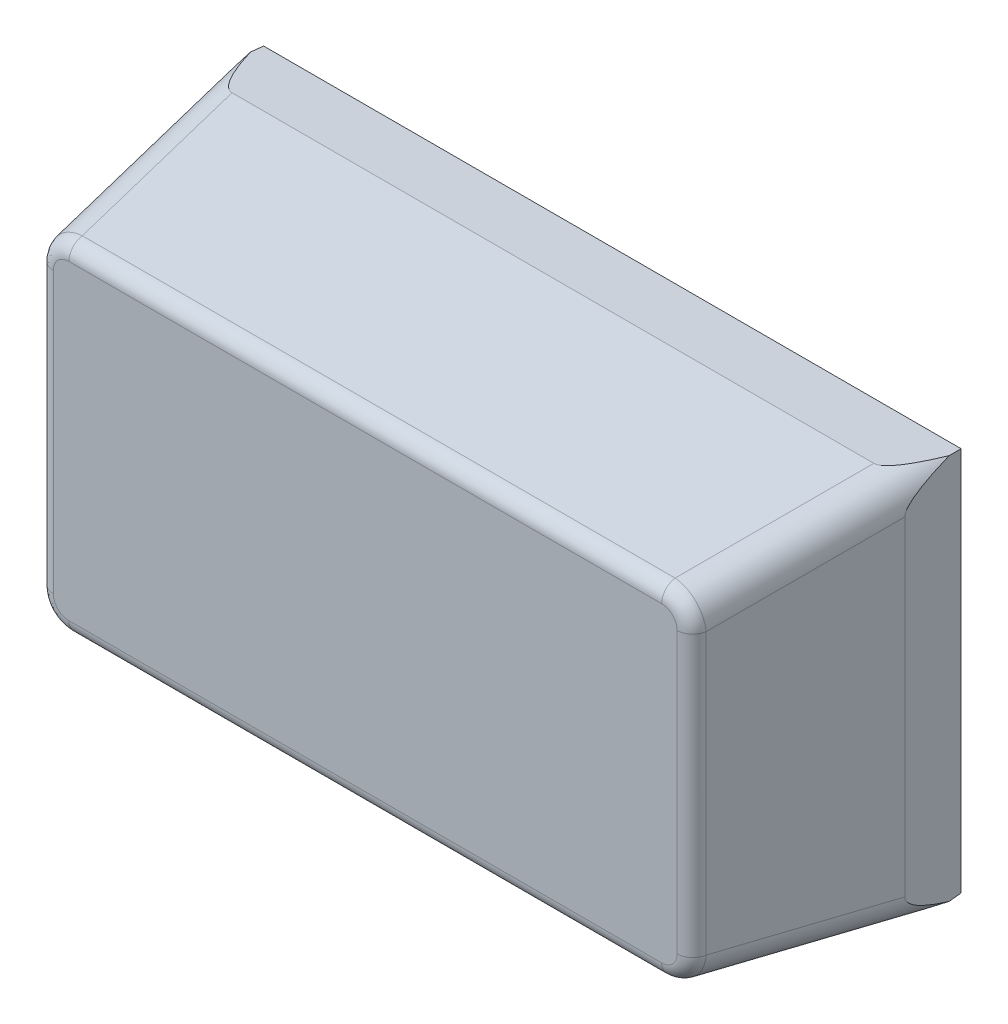
ISO-10303-21;
HEADER;
FILE_DESCRIPTION(('STEP AP214'),'2;1');
FILE_NAME('part.step','',(''),(''),'','','');
FILE_SCHEMA(('AUTOMOTIVE_DESIGN { 1 0 10303 214 1 1 1 1 }'));
ENDSEC;
DATA;
#1=APPLICATION_CONTEXT('core data for automotive mechanical design processes');
#2=APPLICATION_PROTOCOL_DEFINITION('international standard','automotive_design',2000,#1);
#3=PRODUCT_CONTEXT('',#1,'mechanical');
#4=PRODUCT('Part','Part','',(#3));
#5=PRODUCT_RELATED_PRODUCT_CATEGORY('part','',(#4));
#6=PRODUCT_DEFINITION_FORMATION('','',#4);
#7=PRODUCT_DEFINITION_CONTEXT('part definition',#1,'design');
#8=PRODUCT_DEFINITION('design','',#6,#7);
#9=PRODUCT_DEFINITION_SHAPE('','',#8);
#10=(LENGTH_UNIT() NAMED_UNIT(*) SI_UNIT(.MILLI.,.METRE.));
#11=(NAMED_UNIT(*) PLANE_ANGLE_UNIT() SI_UNIT($,.RADIAN.));
#12=(NAMED_UNIT(*) SI_UNIT($,.STERADIAN.) SOLID_ANGLE_UNIT());
#13=UNCERTAINTY_MEASURE_WITH_UNIT(LENGTH_MEASURE(1.E-05),#10,'distance_accuracy_value','');
#14=(GEOMETRIC_REPRESENTATION_CONTEXT(3) GLOBAL_UNCERTAINTY_ASSIGNED_CONTEXT((#13)) GLOBAL_UNIT_ASSIGNED_CONTEXT((#10,
#11,#12)) REPRESENTATION_CONTEXT('',''));
#15=CARTESIAN_POINT('',(0.,0.,0.));
#16=DIRECTION('',(0.,0.,1.));
#17=DIRECTION('',(1.,0.,0.));
#18=AXIS2_PLACEMENT_3D('',#15,#16,#17);
#19=CARTESIAN_POINT('',(27.87499984,24.459995486836,1.6));
#20=DIRECTION('',(0.,0.,1.));
#21=DIRECTION('',(1.,0.,0.));
#22=AXIS2_PLACEMENT_3D('',#19,#20,#21);
#23=PLANE('',#22);
#24=CARTESIAN_POINT('',(29.770395357701,25.454417811411,1.6));
#25=CARTESIAN_POINT('',(29.792772197807,25.454417811411,1.6));
#26=CARTESIAN_POINT('',(29.844777688286,25.436497601739,1.6));
#27=CARTESIAN_POINT('',(29.869422164575,25.385226791345,1.6));
#28=CARTESIAN_POINT('',(29.869422164575,25.355391004537,1.6));
#29=B_SPLINE_CURVE_WITH_KNOTS('',3,(#24,#25,#26,#27,#28),.UNSPECIFIED.,.F.,.F.,(4,1,4),
(-0.775712981729,-0.110816140247,0.775712981729),.UNSPECIFIED.);
#30=CARTESIAN_POINT('',(29.869422164575,25.355391004537,1.6));
#31=VERTEX_POINT('',#30);
#32=CARTESIAN_POINT('',(29.770395357701,25.454417811411,1.6));
#33=VERTEX_POINT('',#32);
#34=EDGE_CURVE('E436',#31,#33,#29,.F.);
#35=ORIENTED_EDGE('',*,*,#34,.T.);
#36=DIRECTION('',(1.,0.,0.));
#37=VECTOR('',#36,1.);
#38=CARTESIAN_POINT('',(28.43749984,25.454417811411,1.6));
#39=LINE('',#38,#37);
#40=CARTESIAN_POINT('',(25.979604322299,25.454417811411,1.6));
#41=VERTEX_POINT('',#40);
#42=EDGE_CURVE('E374',#41,#33,#39,.T.);
#43=ORIENTED_EDGE('',*,*,#42,.F.);
#44=CARTESIAN_POINT('',(25.880577515424,25.355391004537,1.6));
#45=CARTESIAN_POINT('',(25.880577515424,25.377767844643,1.6));
#46=CARTESIAN_POINT('',(25.898497725097,25.429773335122,1.6));
#47=CARTESIAN_POINT('',(25.949768535491,25.454417811411,1.6));
#48=CARTESIAN_POINT('',(25.979604322299,25.454417811411,1.6));
#49=B_SPLINE_CURVE_WITH_KNOTS('',3,(#44,#45,#46,#47,#48),.UNSPECIFIED.,.F.,.F.,(4,1,4),
(-0.775712981729,-0.110816140247,0.775712981729),.UNSPECIFIED.);
#50=CARTESIAN_POINT('',(25.880577515424,25.355391004537,1.6));
#51=VERTEX_POINT('',#50);
#52=EDGE_CURVE('E553',#41,#51,#49,.F.);
#53=ORIENTED_EDGE('',*,*,#52,.T.);
#54=DIRECTION('',(0.,1.,0.));
#55=VECTOR('',#54,1.);
#56=CARTESIAN_POINT('',(25.880577515424,24.772495486836,1.6));
#57=LINE('',#56,#55);
#58=CARTESIAN_POINT('',(25.880577515424,23.564599969135,1.6));
#59=VERTEX_POINT('',#58);
#60=EDGE_CURVE('E286',#59,#51,#57,.T.);
#61=ORIENTED_EDGE('',*,*,#60,.F.);
#62=CARTESIAN_POINT('',(25.979604322299,23.46557316226,1.6));
#63=CARTESIAN_POINT('',(25.957227482193,23.46557316226,1.6));
#64=CARTESIAN_POINT('',(25.905221991713,23.483493371933,1.6));
#65=CARTESIAN_POINT('',(25.880577515424,23.534764182327,1.6));
#66=CARTESIAN_POINT('',(25.880577515424,23.564599969135,1.6));
#67=B_SPLINE_CURVE_WITH_KNOTS('',3,(#62,#63,#64,#65,#66),.UNSPECIFIED.,.F.,.F.,(4,1,4),
(-0.775712981729,-0.110816140247,0.775712981729),.UNSPECIFIED.);
#68=CARTESIAN_POINT('',(25.979604322299,23.46557316226,1.6));
#69=VERTEX_POINT('',#68);
#70=EDGE_CURVE('E537',#59,#69,#67,.F.);
#71=ORIENTED_EDGE('',*,*,#70,.T.);
#72=DIRECTION('',(-1.,0.,0.));
#73=VECTOR('',#72,1.);
#74=CARTESIAN_POINT('',(27.31249984,23.46557316226,1.6));
#75=LINE('',#74,#73);
#76=CARTESIAN_POINT('',(29.770395357701,23.46557316226,1.6));
#77=VERTEX_POINT('',#76);
#78=EDGE_CURVE('E526',#77,#69,#75,.T.);
#79=ORIENTED_EDGE('',*,*,#78,.F.);
#80=CARTESIAN_POINT('',(29.869422164575,23.564599969135,1.6));
#81=CARTESIAN_POINT('',(29.869422164575,23.542223129029,1.6));
#82=CARTESIAN_POINT('',(29.851501954903,23.490217638549,1.6));
#83=CARTESIAN_POINT('',(29.800231144509,23.46557316226,1.6));
#84=CARTESIAN_POINT('',(29.770395357701,23.46557316226,1.6));
#85=B_SPLINE_CURVE_WITH_KNOTS('',3,(#80,#81,#82,#83,#84),.UNSPECIFIED.,.F.,.F.,(4,1,4),
(-0.775712981729,-0.110816140247,0.775712981729),.UNSPECIFIED.);
#86=CARTESIAN_POINT('',(29.869422164575,23.564599969135,1.6));
#87=VERTEX_POINT('',#86);
#88=EDGE_CURVE('E533',#77,#87,#85,.F.);
#89=ORIENTED_EDGE('',*,*,#88,.T.);
#90=DIRECTION('',(0.,-1.,0.));
#91=VECTOR('',#90,1.);
#92=CARTESIAN_POINT('',(29.869422164575,24.147495486836,1.6));
#93=LINE('',#92,#91);
#94=EDGE_CURVE('E429',#31,#87,#93,.T.);
#95=ORIENTED_EDGE('',*,*,#94,.F.);
#96=EDGE_LOOP('',(#35,#43,#53,#61,#71,#79,#89,#95));
#97=FACE_BOUND('',#96,.T.);
#98=ADVANCED_FACE('F17',(#97),#23,.T.);
#99=CARTESIAN_POINT('',(27.31249984,23.46557316226,1.5));
#100=DIRECTION('',(-1.,0.,0.));
#101=DIRECTION('',(0.,-1.,0.));
#102=AXIS2_PLACEMENT_3D('',#99,#100,#101);
#103=CYLINDRICAL_SURFACE('',#102,0.1);
#104=CARTESIAN_POINT('',(29.770395357701,23.46557316226,1.6));
#105=CARTESIAN_POINT('',(29.770395357701,23.438312781563,1.6));
#106=CARTESIAN_POINT('',(29.770395357701,23.390923922426,1.579403749562));
#107=CARTESIAN_POINT('',(29.770395357701,23.369391789173,1.534163623506));
#108=CARTESIAN_POINT('',(29.770395357701,23.366546355386,1.513917310096));
#109=B_SPLINE_CURVE_WITH_KNOTS('',3,(#104,#105,#106,#107,#108),.UNSPECIFIED.,.F.,.F.,(4,1,4),
(0.,0.571428571429,1.),.UNSPECIFIED.);
#110=CARTESIAN_POINT('',(29.770395357701,23.3665463553862,1.51391731009597));
#111=VERTEX_POINT('',#110);
#112=EDGE_CURVE('E507',#111,#77,#109,.F.);
#113=ORIENTED_EDGE('',*,*,#112,.T.);
#114=ORIENTED_EDGE('',*,*,#78,.T.);
#115=CARTESIAN_POINT('',(25.979604322299,23.366546355386,1.513917310096));
#116=CARTESIAN_POINT('',(25.979604322299,23.369391789173,1.534163623506));
#117=CARTESIAN_POINT('',(25.979604322299,23.390923922426,1.579403749562));
#118=CARTESIAN_POINT('',(25.979604322299,23.438312781563,1.6));
#119=CARTESIAN_POINT('',(25.979604322299,23.46557316226,1.6));
#120=B_SPLINE_CURVE_WITH_KNOTS('',3,(#115,#116,#117,#118,#119),.UNSPECIFIED.,.F.,.F.,(4,1,4),
(0.,0.428571428571,1.),.UNSPECIFIED.);
#121=CARTESIAN_POINT('',(25.979604322299,23.3665463553863,1.51391731009597));
#122=VERTEX_POINT('',#121);
#123=EDGE_CURVE('E548',#69,#122,#120,.F.);
#124=ORIENTED_EDGE('',*,*,#123,.T.);
#125=DIRECTION('',(1.,0.,0.));
#126=VECTOR('',#125,1.);
#127=CARTESIAN_POINT('',(26.74999984,23.3665463553858,1.51391731009602));
#128=LINE('',#127,#126);
#129=EDGE_CURVE('E284',#111,#122,#128,.F.);
#130=ORIENTED_EDGE('',*,*,#129,.F.);
#131=EDGE_LOOP('',(#113,#114,#124,#130));
#132=FACE_BOUND('',#131,.T.);
#133=ADVANCED_FACE('F479',(#132),#103,.T.);
#134=CARTESIAN_POINT('',(29.869422164575,23.564599969135,1.6));
#135=CARTESIAN_POINT('',(29.869422164575,23.542223129029,1.6));
#136=CARTESIAN_POINT('',(29.851501954903,23.490217638549,1.6));
#137=CARTESIAN_POINT('',(29.800231144509,23.46557316226,1.6));
#138=CARTESIAN_POINT('',(29.770395357701,23.46557316226,1.6));
#139=CARTESIAN_POINT('',(29.896682545273,23.564599969135,1.6));
#140=CARTESIAN_POINT('',(29.896091933837,23.536162177792,1.599981514956));
#141=CARTESIAN_POINT('',(29.872553004294,23.470846015028,1.600018425103));
#142=CARTESIAN_POINT('',(29.808312412825,23.439100263477,1.599975353274));
#143=CARTESIAN_POINT('',(29.770395357701,23.438312781563,1.6));
#144=CARTESIAN_POINT('',(29.94407140441,23.564599969135,1.579403749562));
#145=CARTESIAN_POINT('',(29.942512173285,23.525690770421,1.580335356779));
#146=CARTESIAN_POINT('',(29.909229722522,23.437117142633,1.581663248521));
#147=CARTESIAN_POINT('',(29.82227428932,23.393002897259,1.580645892518));
#148=CARTESIAN_POINT('',(29.770395357701,23.390923922426,1.579403749562));
#149=CARTESIAN_POINT('',(29.965603537663,23.564599969135,1.534163623506));
#150=CARTESIAN_POINT('',(29.964615523762,23.520890039066,1.536673629749));
#151=CARTESIAN_POINT('',(29.928025975,23.42001624079,1.540424754506));
#152=CARTESIAN_POINT('',(29.828675264459,23.370709141041,1.537510298497));
#153=CARTESIAN_POINT('',(29.770395357701,23.369391789173,1.534163623506));
#154=CARTESIAN_POINT('',(29.96844897145,23.564599969135,1.513917310096));
#155=CARTESIAN_POINT('',(29.968023786504,23.520271473869,1.516942658188));
#156=CARTESIAN_POINT('',(29.931535708767,23.416908151302,1.521550987102));
#157=CARTESIAN_POINT('',(29.829500018056,23.367113268648,1.517951107552));
#158=CARTESIAN_POINT('',(29.770395357701,23.366546355386,1.513917310096));
#159=B_SPLINE_SURFACE_WITH_KNOTS('',3,3,((#134,#135,#136,#137,#138),(#139,#140,#141,#142,#143),
(#144,#145,#146,#147,#148),(#149,#150,#151,#152,#153),(#154,#155,#156,#157,#158)),.UNSPECIFIED.,
.F.,.F.,.F.,(4,1,4),(4,1,4),(0.,0.571428571429,1.),(-0.775712981729,-0.110816140247,
0.775712981729),.UNSPECIFIED.);
#160=CARTESIAN_POINT('',(29.770395357701,23.366546355386,1.513917310096));
#161=CARTESIAN_POINT('',(29.829500018056,23.367113268648,1.517951107552));
#162=CARTESIAN_POINT('',(29.931535708767,23.416908151302,1.521550987102));
#163=CARTESIAN_POINT('',(29.968023786504,23.520271473869,1.516942658188));
#164=CARTESIAN_POINT('',(29.96844897145,23.564599969135,1.513917310096));
#165=B_SPLINE_CURVE_WITH_KNOTS('',3,(#160,#161,#162,#163,#164),.UNSPECIFIED.,.F.,.F.,(4,1,4),
(-0.775712981729,0.110816140247,0.775712981729),.UNSPECIFIED.);
#166=CARTESIAN_POINT('',(29.9684489714498,23.564599969135,1.51391731009597));
#167=VERTEX_POINT('',#166);
#168=EDGE_CURVE('E277',#167,#111,#165,.F.);
#169=CARTESIAN_POINT('',(29.96844897145,23.564599969135,1.513917310096));
#170=CARTESIAN_POINT('',(29.965603537663,23.564599969135,1.534163623506));
#171=CARTESIAN_POINT('',(29.94407140441,23.564599969135,1.579403749562));
#172=CARTESIAN_POINT('',(29.896682545273,23.564599969135,1.6));
#173=CARTESIAN_POINT('',(29.869422164575,23.564599969135,1.6));
#174=B_SPLINE_CURVE_WITH_KNOTS('',3,(#169,#170,#171,#172,#173),.UNSPECIFIED.,.F.,.F.,(4,1,4),
(0.,0.428571428571,1.),.UNSPECIFIED.);
#175=EDGE_CURVE('E437',#87,#167,#174,.F.);
#176=ORIENTED_EDGE('',*,*,#168,.F.);
#177=ORIENTED_EDGE('',*,*,#175,.F.);
#178=ORIENTED_EDGE('',*,*,#88,.F.);
#179=ORIENTED_EDGE('',*,*,#112,.F.);
#180=EDGE_LOOP('',(#176,#177,#178,#179));
#181=FACE_BOUND('',#180,.T.);
#182=ADVANCED_FACE('F468',(#181),#159,.F.);
#183=CARTESIAN_POINT('',(29.869422164575,24.147495486836,1.5));
#184=DIRECTION('',(0.,-1.,0.));
#185=DIRECTION('',(1.,0.,0.));
#186=AXIS2_PLACEMENT_3D('',#183,#184,#185);
#187=CYLINDRICAL_SURFACE('',#186,0.1);
#188=CARTESIAN_POINT('',(29.869422164575,25.355391004537,1.6));
#189=CARTESIAN_POINT('',(29.896682545273,25.355391004537,1.6));
#190=CARTESIAN_POINT('',(29.94407140441,25.355391004537,1.579403749562));
#191=CARTESIAN_POINT('',(29.965603537663,25.355391004537,1.534163623506));
#192=CARTESIAN_POINT('',(29.96844897145,25.355391004537,1.513917310096));
#193=B_SPLINE_CURVE_WITH_KNOTS('',3,(#188,#189,#190,#191,#192),.UNSPECIFIED.,.F.,.F.,(4,1,4),
(0.,0.571428571429,1.),.UNSPECIFIED.);
#194=CARTESIAN_POINT('',(29.9684489714496,25.3553910045369,1.51391731009593));
#195=VERTEX_POINT('',#194);
#196=EDGE_CURVE('E414',#195,#31,#193,.F.);
#197=ORIENTED_EDGE('',*,*,#196,.T.);
#198=ORIENTED_EDGE('',*,*,#94,.T.);
#199=ORIENTED_EDGE('',*,*,#175,.T.);
#200=DIRECTION('',(0.,1.,0.));
#201=VECTOR('',#200,1.);
#202=CARTESIAN_POINT('',(29.9684489714502,23.834995486836,1.51391731009602));
#203=LINE('',#202,#201);
#204=EDGE_CURVE('E276',#195,#167,#203,.F.);
#205=ORIENTED_EDGE('',*,*,#204,.F.);
#206=EDGE_LOOP('',(#197,#198,#199,#205));
#207=FACE_BOUND('',#206,.T.);
#208=ADVANCED_FACE('F386',(#207),#187,.T.);
#209=CARTESIAN_POINT('',(29.770395357701,25.454417811411,1.6));
#210=CARTESIAN_POINT('',(29.792772197807,25.454417811411,1.6));
#211=CARTESIAN_POINT('',(29.844777688286,25.436497601739,1.6));
#212=CARTESIAN_POINT('',(29.869422164575,25.385226791345,1.6));
#213=CARTESIAN_POINT('',(29.869422164575,25.355391004537,1.6));
#214=CARTESIAN_POINT('',(29.770395357701,25.481678192109,1.6));
#215=CARTESIAN_POINT('',(29.798833149044,25.481087580673,1.599981514956));
#216=CARTESIAN_POINT('',(29.864149311808,25.45754865113,1.600018425103));
#217=CARTESIAN_POINT('',(29.895895063358,25.393308059661,1.599975353274));
#218=CARTESIAN_POINT('',(29.896682545273,25.355391004537,1.6));
#219=CARTESIAN_POINT('',(29.770395357701,25.529067051246,1.579403749562));
#220=CARTESIAN_POINT('',(29.809304556415,25.527507820121,1.580335356779));
#221=CARTESIAN_POINT('',(29.897878184203,25.494225369358,1.581663248521));
#222=CARTESIAN_POINT('',(29.941992429577,25.407269936156,1.580645892518));
#223=CARTESIAN_POINT('',(29.94407140441,25.355391004537,1.579403749562));
#224=CARTESIAN_POINT('',(29.770395357701,25.550599184499,1.534163623506));
#225=CARTESIAN_POINT('',(29.814105287769,25.549611170598,1.536673629749));
#226=CARTESIAN_POINT('',(29.914979086046,25.513021621836,1.540424754506));
#227=CARTESIAN_POINT('',(29.964286185795,25.413670911295,1.537510298497));
#228=CARTESIAN_POINT('',(29.965603537663,25.355391004537,1.534163623506));
#229=CARTESIAN_POINT('',(29.770395357701,25.553444618286,1.513917310096));
#230=CARTESIAN_POINT('',(29.814723852967,25.553019433339,1.516942658188));
#231=CARTESIAN_POINT('',(29.918087175533,25.516531355603,1.521550987102));
#232=CARTESIAN_POINT('',(29.967882058188,25.414495664891,1.517951107552));
#233=CARTESIAN_POINT('',(29.96844897145,25.355391004537,1.513917310096));
#234=B_SPLINE_SURFACE_WITH_KNOTS('',3,3,((#209,#210,#211,#212,#213),(#214,#215,#216,#217,#218),
(#219,#220,#221,#222,#223),(#224,#225,#226,#227,#228),(#229,#230,#231,#232,#233)),.UNSPECIFIED.,
.F.,.F.,.F.,(4,1,4),(4,1,4),(0.,0.571428571429,1.),(-0.775712981729,-0.110816140247,
0.775712981729),.UNSPECIFIED.);
#235=CARTESIAN_POINT('',(29.96844897145,25.355391004537,1.513917310096));
#236=CARTESIAN_POINT('',(29.967882058188,25.414495664891,1.517951107552));
#237=CARTESIAN_POINT('',(29.918087175533,25.516531355603,1.521550987102));
#238=CARTESIAN_POINT('',(29.814723852967,25.553019433339,1.516942658188));
#239=CARTESIAN_POINT('',(29.770395357701,25.553444618286,1.513917310096));
#240=B_SPLINE_CURVE_WITH_KNOTS('',3,(#235,#236,#237,#238,#239),.UNSPECIFIED.,.F.,.F.,(4,1,4),
(-0.775712981729,0.110816140247,0.775712981729),.UNSPECIFIED.);
#241=CARTESIAN_POINT('',(29.770395357701,25.5534446182854,1.51391731009592));
#242=VERTEX_POINT('',#241);
#243=EDGE_CURVE('E239',#242,#195,#240,.F.);
#244=CARTESIAN_POINT('',(29.770395357701,25.553444618286,1.513917310096));
#245=CARTESIAN_POINT('',(29.770395357701,25.550599184499,1.534163623506));
#246=CARTESIAN_POINT('',(29.770395357701,25.529067051246,1.579403749562));
#247=CARTESIAN_POINT('',(29.770395357701,25.481678192109,1.6));
#248=CARTESIAN_POINT('',(29.770395357701,25.454417811411,1.6));
#249=B_SPLINE_CURVE_WITH_KNOTS('',3,(#244,#245,#246,#247,#248),.UNSPECIFIED.,.F.,.F.,(4,1,4),
(0.,0.428571428571,1.),.UNSPECIFIED.);
#250=EDGE_CURVE('E403',#33,#242,#249,.F.);
#251=ORIENTED_EDGE('',*,*,#243,.F.);
#252=ORIENTED_EDGE('',*,*,#250,.F.);
#253=ORIENTED_EDGE('',*,*,#34,.F.);
#254=ORIENTED_EDGE('',*,*,#196,.F.);
#255=EDGE_LOOP('',(#251,#252,#253,#254));
#256=FACE_BOUND('',#255,.T.);
#257=ADVANCED_FACE('F325',(#256),#234,.F.);
#258=CARTESIAN_POINT('',(28.43749984,25.454417811411,1.5));
#259=DIRECTION('',(1.,0.,0.));
#260=DIRECTION('',(0.,1.,0.));
#261=AXIS2_PLACEMENT_3D('',#258,#259,#260);
#262=CYLINDRICAL_SURFACE('',#261,0.1);
#263=CARTESIAN_POINT('',(25.979604322299,25.454417811411,1.6));
#264=CARTESIAN_POINT('',(25.979604322299,25.481678192109,1.6));
#265=CARTESIAN_POINT('',(25.979604322299,25.529067051246,1.579403749562));
#266=CARTESIAN_POINT('',(25.979604322299,25.550599184499,1.534163623506));
#267=CARTESIAN_POINT('',(25.979604322299,25.553444618286,1.513917310096));
#268=B_SPLINE_CURVE_WITH_KNOTS('',3,(#263,#264,#265,#266,#267),.UNSPECIFIED.,.F.,.F.,(4,1,4),
(0.,0.571428571429,1.),.UNSPECIFIED.);
#269=CARTESIAN_POINT('',(25.979604322299,25.5534446182855,1.51391731009593));
#270=VERTEX_POINT('',#269);
#271=EDGE_CURVE('E357',#270,#41,#268,.F.);
#272=ORIENTED_EDGE('',*,*,#271,.T.);
#273=ORIENTED_EDGE('',*,*,#42,.T.);
#274=ORIENTED_EDGE('',*,*,#250,.T.);
#275=DIRECTION('',(1.,0.,0.));
#276=VECTOR('',#275,1.);
#277=CARTESIAN_POINT('',(28.99999984,25.5534446182852,1.51391731009589));
#278=LINE('',#277,#276);
#279=EDGE_CURVE('E227',#270,#242,#278,.T.);
#280=ORIENTED_EDGE('',*,*,#279,.F.);
#281=EDGE_LOOP('',(#272,#273,#274,#280));
#282=FACE_BOUND('',#281,.T.);
#283=ADVANCED_FACE('F324',(#282),#262,.T.);
#284=CARTESIAN_POINT('',(25.880577515424,25.355391004537,1.6));
#285=CARTESIAN_POINT('',(25.880577515424,25.377767844643,1.6));
#286=CARTESIAN_POINT('',(25.898497725097,25.429773335122,1.6));
#287=CARTESIAN_POINT('',(25.949768535491,25.454417811411,1.6));
#288=CARTESIAN_POINT('',(25.979604322299,25.454417811411,1.6));
#289=CARTESIAN_POINT('',(25.853317134727,25.355391004537,1.6));
#290=CARTESIAN_POINT('',(25.853907746163,25.38382879588,1.599981514956));
#291=CARTESIAN_POINT('',(25.877446675706,25.449144958644,1.600018425103));
#292=CARTESIAN_POINT('',(25.941687267175,25.480890710194,1.599975353274));
#293=CARTESIAN_POINT('',(25.979604322299,25.481678192109,1.6));
#294=CARTESIAN_POINT('',(25.80592827559,25.355391004537,1.579403749562));
#295=CARTESIAN_POINT('',(25.807487506715,25.394300203251,1.580335356779));
#296=CARTESIAN_POINT('',(25.840769957478,25.482873831039,1.581663248521));
#297=CARTESIAN_POINT('',(25.92772539068,25.526988076413,1.580645892518));
#298=CARTESIAN_POINT('',(25.979604322299,25.529067051246,1.579403749562));
#299=CARTESIAN_POINT('',(25.784396142337,25.355391004537,1.534163623506));
#300=CARTESIAN_POINT('',(25.785384156238,25.399100934605,1.536673629749));
#301=CARTESIAN_POINT('',(25.821973705,25.499974732882,1.540424754506));
#302=CARTESIAN_POINT('',(25.921324415541,25.549281832631,1.537510298497));
#303=CARTESIAN_POINT('',(25.979604322299,25.550599184499,1.534163623506));
#304=CARTESIAN_POINT('',(25.78155070855,25.355391004537,1.513917310096));
#305=CARTESIAN_POINT('',(25.781975893496,25.399719499803,1.516942658188));
#306=CARTESIAN_POINT('',(25.818463971233,25.503082822369,1.521550987102));
#307=CARTESIAN_POINT('',(25.920499661944,25.552877705024,1.517951107552));
#308=CARTESIAN_POINT('',(25.979604322299,25.553444618286,1.513917310096));
#309=B_SPLINE_SURFACE_WITH_KNOTS('',3,3,((#284,#285,#286,#287,#288),(#289,#290,#291,#292,#293),
(#294,#295,#296,#297,#298),(#299,#300,#301,#302,#303),(#304,#305,#306,#307,#308)),.UNSPECIFIED.,
.F.,.F.,.F.,(4,1,4),(4,1,4),(0.,0.571428571429,1.),(-0.775712981729,-0.110816140247,
0.775712981729),.UNSPECIFIED.);
#310=CARTESIAN_POINT('',(25.979604322299,25.553444618286,1.513917310096));
#311=CARTESIAN_POINT('',(25.920499661944,25.552877705024,1.517951107552));
#312=CARTESIAN_POINT('',(25.818463971233,25.503082822369,1.521550987102));
#313=CARTESIAN_POINT('',(25.781975893496,25.399719499803,1.516942658188));
#314=CARTESIAN_POINT('',(25.78155070855,25.355391004537,1.513917310096));
#315=B_SPLINE_CURVE_WITH_KNOTS('',3,(#310,#311,#312,#313,#314),.UNSPECIFIED.,.F.,.F.,(4,1,4),
(-0.775712981729,0.110816140247,0.775712981729),.UNSPECIFIED.);
#316=CARTESIAN_POINT('',(25.78155070855,25.355391004537,1.51391731009599));
#317=VERTEX_POINT('',#316);
#318=EDGE_CURVE('E222',#317,#270,#315,.F.);
#319=CARTESIAN_POINT('',(25.78155070855,25.355391004537,1.513917310096));
#320=CARTESIAN_POINT('',(25.784396142337,25.355391004537,1.534163623506));
#321=CARTESIAN_POINT('',(25.80592827559,25.355391004537,1.579403749562));
#322=CARTESIAN_POINT('',(25.853317134727,25.355391004537,1.6));
#323=CARTESIAN_POINT('',(25.880577515424,25.355391004537,1.6));
#324=B_SPLINE_CURVE_WITH_KNOTS('',3,(#319,#320,#321,#322,#323),.UNSPECIFIED.,.F.,.F.,(4,1,4),
(0.,0.428571428571,1.),.UNSPECIFIED.);
#325=EDGE_CURVE('E558',#51,#317,#324,.F.);
#326=ORIENTED_EDGE('',*,*,#52,.F.);
#327=ORIENTED_EDGE('',*,*,#271,.F.);
#328=ORIENTED_EDGE('',*,*,#318,.F.);
#329=ORIENTED_EDGE('',*,*,#325,.F.);
#330=EDGE_LOOP('',(#326,#327,#328,#329));
#331=FACE_BOUND('',#330,.T.);
#332=ADVANCED_FACE('F313',(#331),#309,.F.);
#333=CARTESIAN_POINT('',(25.979604322299,23.46557316226,1.6));
#334=CARTESIAN_POINT('',(25.957227482193,23.46557316226,1.6));
#335=CARTESIAN_POINT('',(25.905221991713,23.483493371933,1.6));
#336=CARTESIAN_POINT('',(25.880577515424,23.534764182327,1.6));
#337=CARTESIAN_POINT('',(25.880577515424,23.564599969135,1.6));
#338=CARTESIAN_POINT('',(25.979604322299,23.438312781563,1.6));
#339=CARTESIAN_POINT('',(25.951166530956,23.438903392999,1.599981514956));
#340=CARTESIAN_POINT('',(25.885850368192,23.462442322542,1.600018425103));
#341=CARTESIAN_POINT('',(25.854104616641,23.526682914011,1.599975353274));
#342=CARTESIAN_POINT('',(25.853317134727,23.564599969135,1.6));
#343=CARTESIAN_POINT('',(25.979604322299,23.390923922426,1.579403749562));
#344=CARTESIAN_POINT('',(25.940695123585,23.39248315355,1.580335356779));
#345=CARTESIAN_POINT('',(25.852121495797,23.425765604314,1.581663248521));
#346=CARTESIAN_POINT('',(25.808007250423,23.512721037516,1.580645892518));
#347=CARTESIAN_POINT('',(25.80592827559,23.564599969135,1.579403749562));
#348=CARTESIAN_POINT('',(25.979604322299,23.369391789173,1.534163623506));
#349=CARTESIAN_POINT('',(25.935894392231,23.370379803074,1.536673629749));
#350=CARTESIAN_POINT('',(25.835020593954,23.406969351836,1.540424754506));
#351=CARTESIAN_POINT('',(25.785713494205,23.506320062377,1.537510298497));
#352=CARTESIAN_POINT('',(25.784396142337,23.564599969135,1.534163623506));
#353=CARTESIAN_POINT('',(25.979604322299,23.366546355386,1.513917310096));
#354=CARTESIAN_POINT('',(25.935275827033,23.366971540332,1.516942658188));
#355=CARTESIAN_POINT('',(25.831912504467,23.403459618069,1.521550987102));
#356=CARTESIAN_POINT('',(25.782117621812,23.50549530878,1.517951107552));
#357=CARTESIAN_POINT('',(25.78155070855,23.564599969135,1.513917310096));
#358=B_SPLINE_SURFACE_WITH_KNOTS('',3,3,((#333,#334,#335,#336,#337),(#338,#339,#340,#341,#342),
(#343,#344,#345,#346,#347),(#348,#349,#350,#351,#352),(#353,#354,#355,#356,#357)),.UNSPECIFIED.,
.F.,.F.,.F.,(4,1,4),(4,1,4),(0.,0.571428571429,1.),(-0.775712981729,-0.110816140247,
0.775712981729),.UNSPECIFIED.);
#359=CARTESIAN_POINT('',(25.78155070855,23.564599969135,1.513917310096));
#360=CARTESIAN_POINT('',(25.782117621812,23.50549530878,1.517951107552));
#361=CARTESIAN_POINT('',(25.831912504467,23.403459618069,1.521550987102));
#362=CARTESIAN_POINT('',(25.935275827033,23.366971540332,1.516942658188));
#363=CARTESIAN_POINT('',(25.979604322299,23.366546355386,1.513917310096));
#364=B_SPLINE_CURVE_WITH_KNOTS('',3,(#359,#360,#361,#362,#363),.UNSPECIFIED.,.F.,.F.,(4,1,4),
(-0.775712981729,0.110816140247,0.775712981729),.UNSPECIFIED.);
#365=CARTESIAN_POINT('',(25.7815507085501,23.564599969135,1.51391731009599));
#366=VERTEX_POINT('',#365);
#367=EDGE_CURVE('E181',#122,#366,#364,.F.);
#368=CARTESIAN_POINT('',(25.880577515424,23.564599969135,1.6));
#369=CARTESIAN_POINT('',(25.853317134727,23.564599969135,1.6));
#370=CARTESIAN_POINT('',(25.80592827559,23.564599969135,1.579403749562));
#371=CARTESIAN_POINT('',(25.784396142337,23.564599969135,1.534163623506));
#372=CARTESIAN_POINT('',(25.78155070855,23.564599969135,1.513917310096));
#373=B_SPLINE_CURVE_WITH_KNOTS('',3,(#368,#369,#370,#371,#372),.UNSPECIFIED.,.F.,.F.,(4,1,4),
(0.,0.571428571429,1.),.UNSPECIFIED.);
#374=EDGE_CURVE('E546',#366,#59,#373,.F.);
#375=ORIENTED_EDGE('',*,*,#367,.F.);
#376=ORIENTED_EDGE('',*,*,#123,.F.);
#377=ORIENTED_EDGE('',*,*,#70,.F.);
#378=ORIENTED_EDGE('',*,*,#374,.F.);
#379=EDGE_LOOP('',(#375,#376,#377,#378));
#380=FACE_BOUND('',#379,.T.);
#381=ADVANCED_FACE('F19',(#380),#358,.F.);
#382=CARTESIAN_POINT('',(25.880577515424,24.772495486836,1.5));
#383=DIRECTION('',(0.,1.,0.));
#384=DIRECTION('',(-1.,0.,0.));
#385=AXIS2_PLACEMENT_3D('',#382,#383,#384);
#386=CYLINDRICAL_SURFACE('',#385,0.1);
#387=ORIENTED_EDGE('',*,*,#374,.T.);
#388=ORIENTED_EDGE('',*,*,#60,.T.);
#389=ORIENTED_EDGE('',*,*,#325,.T.);
#390=DIRECTION('',(0.,1.,0.));
#391=VECTOR('',#390,1.);
#392=CARTESIAN_POINT('',(25.7815507085498,25.084995486836,1.51391731009602));
#393=LINE('',#392,#391);
#394=EDGE_CURVE('E173',#366,#317,#393,.T.);
#395=ORIENTED_EDGE('',*,*,#394,.F.);
#396=EDGE_LOOP('',(#387,#388,#389,#395));
#397=FACE_BOUND('',#396,.T.);
#398=ADVANCED_FACE('F384',(#397),#386,.T.);
#399=CARTESIAN_POINT('',(26.74999984,23.294319987657,1.));
#400=DIRECTION('',(0.,-0.990268068741588,0.139173100959942));
#401=DIRECTION('',(0.,-0.139173100959942,-0.990268068741588));
#402=AXIS2_PLACEMENT_3D('',#399,#400,#401);
#403=PLANE('',#402);
#404=DIRECTION('',(1.,0.,0.));
#405=VECTOR('',#404,1.);
#406=CARTESIAN_POINT('',(26.74999984,23.2099954868362,0.400000000000012));
#407=LINE('',#406,#405);
#408=CARTESIAN_POINT('',(29.9269462262516,23.2099954868361,0.400000000000702));
#409=VERTEX_POINT('',#408);
#410=CARTESIAN_POINT('',(25.8230534537483,23.2099954868362,0.400000000000164));
#411=VERTEX_POINT('',#410);
#412=EDGE_CURVE('E151',#409,#411,#407,.F.);
#413=ORIENTED_EDGE('',*,*,#412,.F.);
#414=DIRECTION('',(-0.137844537491984,0.137844537491984,0.980814848463889));
#415=VECTOR('',#414,1.);
#416=CARTESIAN_POINT('',(29.809984991854,23.3269567212337,1.23222242592409));
#417=LINE('',#416,#415);
#418=EDGE_CURVE('E148',#111,#409,#417,.F.);
#419=ORIENTED_EDGE('',*,*,#418,.F.);
#420=ORIENTED_EDGE('',*,*,#129,.T.);
#421=DIRECTION('',(0.137844537491984,0.137844537491984,0.980814848463889));
#422=VECTOR('',#421,1.);
#423=CARTESIAN_POINT('',(25.9305141298875,23.3174561629757,1.16462244134815));
#424=LINE('',#423,#422);
#425=EDGE_CURVE('E187',#411,#122,#424,.T.);
#426=ORIENTED_EDGE('',*,*,#425,.F.);
#427=EDGE_LOOP('',(#413,#419,#420,#426));
#428=FACE_BOUND('',#427,.T.);
#429=ADVANCED_FACE('F262',(#428),#403,.T.);
#430=CARTESIAN_POINT('',(29.809984991854,23.525010334982,1.204387805732));
#431=DIRECTION('',(-0.137844537491984,0.137844537491984,0.980814848463889));
#432=DIRECTION('',(0.990268068741519,0.,0.139173100960432));
#433=AXIS2_PLACEMENT_3D('',#430,#431,#432);
#434=CYLINDRICAL_SURFACE('',#433,0.2);
#435=CARTESIAN_POINT('',(30.0701429333435,23.2648523934925,-0.646732134175098));
#436=DIRECTION('',(0.998629534754575,0.,-0.0523359562429177));
#437=DIRECTION('',(0.0518177533050842,0.140374151104557,0.988741633665787));
#438=AXIS2_PLACEMENT_3D('',#435,#436,#437);
#439=ELLIPSE('',#438,1.05827099739565,0.2);
#440=CARTESIAN_POINT('',(30.12499984,23.4080491005842,0.400000000001544));
#441=VERTEX_POINT('',#440);
#442=CARTESIAN_POINT('',(30.1093064840874,23.2256888427482,0.10055293074744));
#443=VERTEX_POINT('',#442);
#444=EDGE_CURVE('E129',#441,#443,#439,.T.);
#445=ORIENTED_EDGE('',*,*,#444,.F.);
#446=DIRECTION('',(0.137844537491498,-0.137844537492206,-0.980814848463926));
#447=VECTOR('',#446,1.);
#448=CARTESIAN_POINT('',(29.9684489714502,23.564599969135,1.51391731009602));
#449=LINE('',#448,#447);
#450=EDGE_CURVE('E673',#167,#441,#449,.T.);
#451=ORIENTED_EDGE('',*,*,#450,.F.);
#452=ORIENTED_EDGE('',*,*,#168,.T.);
#453=ORIENTED_EDGE('',*,*,#418,.T.);
#454=CARTESIAN_POINT('',(30.0701429333435,23.2648523934925,-0.646732134175111));
#455=DIRECTION('',(0.,-0.998629534754575,-0.0523359562429177));
#456=DIRECTION('',(-0.140374151104557,-0.0518177533050843,0.988741633665787));
#457=AXIS2_PLACEMENT_3D('',#454,#455,#456);
#458=ELLIPSE('',#457,1.05827099739565,0.2);
#459=EDGE_CURVE('E24',#443,#409,#458,.T.);
#460=ORIENTED_EDGE('',*,*,#459,.F.);
#461=EDGE_LOOP('',(#445,#451,#452,#453,#460));
#462=FACE_BOUND('',#461,.T.);
#463=ADVANCED_FACE('F145',(#462),#434,.T.);
#464=CARTESIAN_POINT('',(30.040675339179,23.834995486836,1.));
#465=DIRECTION('',(0.990268068741588,0.,0.139173100959942));
#466=DIRECTION('',(0.139173100959942,0.,-0.990268068741588));
#467=AXIS2_PLACEMENT_3D('',#464,#465,#466);
#468=PLANE('',#467);
#469=DIRECTION('',(0.,1.,0.));
#470=VECTOR('',#469,1.);
#471=CARTESIAN_POINT('',(30.1249998399998,23.834995486836,0.400000000000012));
#472=LINE('',#471,#470);
#473=CARTESIAN_POINT('',(30.1249998399998,25.5119418730875,0.400000000000165));
#474=VERTEX_POINT('',#473);
#475=EDGE_CURVE('E138',#474,#441,#472,.F.);
#476=ORIENTED_EDGE('',*,*,#475,.F.);
#477=DIRECTION('',(-0.137844537491984,-0.137844537491984,0.980814848463889));
#478=VECTOR('',#477,1.);
#479=CARTESIAN_POINT('',(30.0175391638603,25.404481196948,1.16462244134809));
#480=LINE('',#479,#478);
#481=EDGE_CURVE('E244',#195,#474,#480,.F.);
#482=ORIENTED_EDGE('',*,*,#481,.F.);
#483=ORIENTED_EDGE('',*,*,#204,.T.);
#484=ORIENTED_EDGE('',*,*,#450,.T.);
#485=EDGE_LOOP('',(#476,#482,#483,#484));
#486=FACE_BOUND('',#485,.T.);
#487=ADVANCED_FACE('F255',(#486),#468,.T.);
#488=CARTESIAN_POINT('',(29.819485550112,25.404481196948,1.136787821156));
#489=DIRECTION('',(-0.137844537491984,-0.137844537491984,0.980814848463889));
#490=DIRECTION('',(0.990268068741519,0.,0.139173100960432));
#491=AXIS2_PLACEMENT_3D('',#488,#489,#490);
#492=CYLINDRICAL_SURFACE('',#491,0.2);
#493=CARTESIAN_POINT('',(30.0701429333434,25.6551385801794,-0.646732134176173));
#494=DIRECTION('',(0.,0.998629534754575,-0.0523359562429177));
#495=DIRECTION('',(-0.140374151104557,0.0518177533050842,0.988741633665787));
#496=AXIS2_PLACEMENT_3D('',#493,#494,#495);
#497=ELLIPSE('',#496,1.05827099739565,0.2);
#498=CARTESIAN_POINT('',(29.9269462262519,25.7099954868357,0.399999999999087));
#499=VERTEX_POINT('',#498);
#500=CARTESIAN_POINT('',(30.1093064840877,25.6943021309234,0.100552930746366));
#501=VERTEX_POINT('',#500);
#502=EDGE_CURVE('E648',#499,#501,#497,.T.);
#503=ORIENTED_EDGE('',*,*,#502,.F.);
#504=DIRECTION('',(0.137844537492209,0.137844537491495,-0.980814848463926));
#505=VECTOR('',#504,1.);
#506=CARTESIAN_POINT('',(29.770395357701,25.5534446182852,1.51391731009589));
#507=LINE('',#506,#505);
#508=EDGE_CURVE('E225',#242,#499,#507,.T.);
#509=ORIENTED_EDGE('',*,*,#508,.F.);
#510=ORIENTED_EDGE('',*,*,#243,.T.);
#511=ORIENTED_EDGE('',*,*,#481,.T.);
#512=CARTESIAN_POINT('',(30.0701429333434,25.6551385801794,-0.64673213417617));
#513=DIRECTION('',(0.998629534754575,0.,-0.0523359562429177));
#514=DIRECTION('',(0.0518177533050842,-0.140374151104557,0.988741633665787));
#515=AXIS2_PLACEMENT_3D('',#512,#513,#514);
#516=ELLIPSE('',#515,1.05827099739565,0.2);
#517=EDGE_CURVE('E158',#501,#474,#516,.T.);
#518=ORIENTED_EDGE('',*,*,#517,.F.);
#519=EDGE_LOOP('',(#503,#509,#510,#511,#518));
#520=FACE_BOUND('',#519,.T.);
#521=ADVANCED_FACE('F246',(#520),#492,.T.);
#522=CARTESIAN_POINT('',(28.99999984,25.625670986014,1.));
#523=DIRECTION('',(0.,0.990268068741588,0.139173100959942));
#524=DIRECTION('',(0.,-0.139173100959942,0.990268068741588));
#525=AXIS2_PLACEMENT_3D('',#522,#523,#524);
#526=PLANE('',#525);
#527=DIRECTION('',(1.,0.,0.));
#528=VECTOR('',#527,1.);
#529=CARTESIAN_POINT('',(28.99999984,25.7099954868358,0.400000000000012));
#530=LINE('',#529,#528);
#531=CARTESIAN_POINT('',(25.8230534537484,25.7099954868359,0.4000000000007));
#532=VERTEX_POINT('',#531);
#533=EDGE_CURVE('E643',#532,#499,#530,.T.);
#534=ORIENTED_EDGE('',*,*,#533,.F.);
#535=DIRECTION('',(-0.137844537491984,0.137844537491984,-0.980814848463889));
#536=VECTOR('',#535,1.);
#537=CARTESIAN_POINT('',(25.940014688146,25.5930342524383,1.23222242592409));
#538=LINE('',#537,#536);
#539=EDGE_CURVE('E215',#270,#532,#538,.T.);
#540=ORIENTED_EDGE('',*,*,#539,.F.);
#541=ORIENTED_EDGE('',*,*,#279,.T.);
#542=ORIENTED_EDGE('',*,*,#508,.T.);
#543=EDGE_LOOP('',(#534,#540,#541,#542));
#544=FACE_BOUND('',#543,.T.);
#545=ADVANCED_FACE('F205',(#544),#526,.T.);
#546=CARTESIAN_POINT('',(25.940014688146,25.39498063869,1.204387805732));
#547=DIRECTION('',(-0.137844537491984,0.137844537491984,-0.980814848463889));
#548=DIRECTION('',(-0.990268068741519,0.,0.139173100960432));
#549=AXIS2_PLACEMENT_3D('',#546,#547,#548);
#550=CYLINDRICAL_SURFACE('',#549,0.2);
#551=CARTESIAN_POINT('',(25.6798567466565,25.6551385801795,-0.646732134175098));
#552=DIRECTION('',(-0.998629534754575,0.,-0.0523359562429177));
#553=DIRECTION('',(0.0518177533050842,0.140374151104557,-0.988741633665787));
#554=AXIS2_PLACEMENT_3D('',#551,#552,#553);
#555=ELLIPSE('',#554,1.05827099739565,0.2);
#556=CARTESIAN_POINT('',(25.62499984,25.5119418730878,0.400000000001553));
#557=VERTEX_POINT('',#556);
#558=CARTESIAN_POINT('',(25.6406931959126,25.6943021309238,0.100552930747433));
#559=VERTEX_POINT('',#558);
#560=EDGE_CURVE('E640',#557,#559,#555,.T.);
#561=ORIENTED_EDGE('',*,*,#560,.F.);
#562=DIRECTION('',(-0.137844537491498,0.137844537492206,-0.980814848463926));
#563=VECTOR('',#562,1.);
#564=CARTESIAN_POINT('',(25.7815507085498,25.355391004537,1.51391731009602));
#565=LINE('',#564,#563);
#566=EDGE_CURVE('E169',#317,#557,#565,.T.);
#567=ORIENTED_EDGE('',*,*,#566,.F.);
#568=ORIENTED_EDGE('',*,*,#318,.T.);
#569=ORIENTED_EDGE('',*,*,#539,.T.);
#570=CARTESIAN_POINT('',(25.6798567466565,25.6551385801795,-0.646732134175115));
#571=DIRECTION('',(0.,0.998629534754575,-0.0523359562429177));
#572=DIRECTION('',(-0.140374151104557,-0.0518177533050842,-0.988741633665787));
#573=AXIS2_PLACEMENT_3D('',#570,#571,#572);
#574=ELLIPSE('',#573,1.05827099739565,0.2);
#575=EDGE_CURVE('E646',#559,#532,#574,.T.);
#576=ORIENTED_EDGE('',*,*,#575,.F.);
#577=EDGE_LOOP('',(#561,#567,#568,#569,#576));
#578=FACE_BOUND('',#577,.T.);
#579=ADVANCED_FACE('F200',(#578),#550,.T.);
#580=CARTESIAN_POINT('',(25.930514129888,23.515509776724,1.136787821156));
#581=DIRECTION('',(0.137844537491984,0.137844537491984,0.980814848463889));
#582=DIRECTION('',(0.990268068741519,0.,-0.139173100960432));
#583=AXIS2_PLACEMENT_3D('',#580,#581,#582);
#584=CYLINDRICAL_SURFACE('',#583,0.2);
#585=CARTESIAN_POINT('',(25.6798567466566,23.2648523934926,-0.646732134176174));
#586=DIRECTION('',(0.,-0.998629534754575,-0.0523359562429177));
#587=DIRECTION('',(0.140374151104557,-0.0518177533050842,0.988741633665787));
#588=AXIS2_PLACEMENT_3D('',#585,#586,#587);
#589=ELLIPSE('',#588,1.05827099739565,0.2);
#590=CARTESIAN_POINT('',(25.6406931959126,23.2256888427483,0.100552930746369));
#591=VERTEX_POINT('',#590);
#592=EDGE_CURVE('E141',#411,#591,#589,.T.);
#593=ORIENTED_EDGE('',*,*,#592,.F.);
#594=ORIENTED_EDGE('',*,*,#425,.T.);
#595=ORIENTED_EDGE('',*,*,#367,.T.);
#596=DIRECTION('',(0.137844537491495,0.137844537492206,0.980814848463927));
#597=VECTOR('',#596,1.);
#598=CARTESIAN_POINT('',(25.6249998399996,23.408049100584,0.40000000000005));
#599=LINE('',#598,#597);
#600=CARTESIAN_POINT('',(25.62499984,23.4080491005842,0.400000000001551));
#601=VERTEX_POINT('',#600);
#602=EDGE_CURVE('E152',#601,#366,#599,.T.);
#603=ORIENTED_EDGE('',*,*,#602,.F.);
#604=CARTESIAN_POINT('',(25.6798567466566,23.2648523934926,-0.646732134176171));
#605=DIRECTION('',(-0.998629534754575,0.,-0.0523359562429177));
#606=DIRECTION('',(-0.0518177533050842,0.140374151104557,0.988741633665787));
#607=AXIS2_PLACEMENT_3D('',#604,#605,#606);
#608=ELLIPSE('',#607,1.05827099739565,0.2);
#609=EDGE_CURVE('E629',#591,#601,#608,.T.);
#610=ORIENTED_EDGE('',*,*,#609,.F.);
#611=EDGE_LOOP('',(#593,#594,#595,#603,#610));
#612=FACE_BOUND('',#611,.T.);
#613=ADVANCED_FACE('F189',(#612),#584,.T.);
#614=CARTESIAN_POINT('',(25.709324340821,25.084995486836,1.));
#615=DIRECTION('',(-0.990268068741588,0.,0.139173100959942));
#616=DIRECTION('',(0.139173100959942,0.,0.990268068741588));
#617=AXIS2_PLACEMENT_3D('',#614,#615,#616);
#618=PLANE('',#617);
#619=DIRECTION('',(0.,1.,0.));
#620=VECTOR('',#619,1.);
#621=CARTESIAN_POINT('',(25.6249998400002,25.084995486836,0.400000000000012));
#622=LINE('',#621,#620);
#623=EDGE_CURVE('E627',#601,#557,#622,.T.);
#624=ORIENTED_EDGE('',*,*,#623,.F.);
#625=ORIENTED_EDGE('',*,*,#602,.T.);
#626=ORIENTED_EDGE('',*,*,#394,.T.);
#627=ORIENTED_EDGE('',*,*,#566,.T.);
#628=EDGE_LOOP('',(#624,#625,#626,#627));
#629=FACE_BOUND('',#628,.T.);
#630=ADVANCED_FACE('F199',(#629),#618,.T.);
#631=CARTESIAN_POINT('',(26.74999984,23.2199529649,0.21));
#632=DIRECTION('',(0.,-0.998629534754575,-0.0523359562429177));
#633=DIRECTION('',(0.,0.0523359562429177,-0.998629534754575));
#634=AXIS2_PLACEMENT_3D('',#631,#632,#633);
#635=PLANE('',#634);
#636=DIRECTION('',(1.,0.,0.));
#637=VECTOR('',#636,1.);
#638=CARTESIAN_POINT('',(27.87499984,23.229910442963,0.02));
#639=LINE('',#638,#637);
#640=CARTESIAN_POINT('',(25.6449147961278,23.229910442963,0.0199999999999883));
#641=VERTEX_POINT('',#640);
#642=CARTESIAN_POINT('',(30.1050848838721,23.2299104429631,0.019999999999996));
#643=VERTEX_POINT('',#642);
#644=EDGE_CURVE('E157',#641,#643,#639,.T.);
#645=ORIENTED_EDGE('',*,*,#644,.T.);
#646=DIRECTION('',(-0.0522644276887106,0.0522644276869496,-0.99726468863433));
#647=VECTOR('',#646,1.);
#648=CARTESIAN_POINT('',(30.1093064840874,23.225688842748,0.100552930746033));
#649=LINE('',#648,#647);
#650=EDGE_CURVE('E135',#443,#643,#649,.T.);
#651=ORIENTED_EDGE('',*,*,#650,.F.);
#652=ORIENTED_EDGE('',*,*,#459,.T.);
#653=ORIENTED_EDGE('',*,*,#412,.T.);
#654=ORIENTED_EDGE('',*,*,#592,.T.);
#655=DIRECTION('',(-0.0522644276887106,-0.0522644276869496,0.99726468863433));
#656=VECTOR('',#655,1.);
#657=CARTESIAN_POINT('',(25.6449147961278,23.229910442963,0.0199999999999883));
#658=LINE('',#657,#656);
#659=EDGE_CURVE('E632',#641,#591,#658,.T.);
#660=ORIENTED_EDGE('',*,*,#659,.F.);
#661=EDGE_LOOP('',(#645,#651,#652,#653,#654,#660));
#662=FACE_BOUND('',#661,.T.);
#663=ADVANCED_FACE('F154',(#662),#635,.T.);
#664=CARTESIAN_POINT('',(30.115042361936,23.834995486836,0.21));
#665=DIRECTION('',(0.998629534754575,0.,-0.0523359562429177));
#666=DIRECTION('',(-0.0523359562429177,0.,-0.998629534754575));
#667=AXIS2_PLACEMENT_3D('',#664,#665,#666);
#668=PLANE('',#667);
#669=ORIENTED_EDGE('',*,*,#517,.T.);
#670=ORIENTED_EDGE('',*,*,#475,.T.);
#671=ORIENTED_EDGE('',*,*,#444,.T.);
#672=ORIENTED_EDGE('',*,*,#650,.T.);
#673=DIRECTION('',(0.,1.,0.));
#674=VECTOR('',#673,1.);
#675=CARTESIAN_POINT('',(30.105084883872,24.459995486836,0.02));
#676=LINE('',#675,#674);
#677=CARTESIAN_POINT('',(30.1050848838721,25.6900805307081,0.0199999999999939));
#678=VERTEX_POINT('',#677);
#679=EDGE_CURVE('E230',#643,#678,#676,.T.);
#680=ORIENTED_EDGE('',*,*,#679,.T.);
#681=DIRECTION('',(-0.0522644276992859,-0.0522644276886766,-0.997264688633685));
#682=VECTOR('',#681,1.);
#683=CARTESIAN_POINT('',(30.109306484088,25.6943021309234,0.100552930746033));
#684=LINE('',#683,#682);
#685=EDGE_CURVE('E647',#501,#678,#684,.T.);
#686=ORIENTED_EDGE('',*,*,#685,.F.);
#687=EDGE_LOOP('',(#669,#670,#671,#672,#680,#686));
#688=FACE_BOUND('',#687,.T.);
#689=ADVANCED_FACE('F132',(#688),#668,.T.);
#690=CARTESIAN_POINT('',(28.99999984,25.700038008772,0.21));
#691=DIRECTION('',(0.,0.998629534754575,-0.0523359562429177));
#692=DIRECTION('',(0.,0.0523359562429177,0.998629534754575));
#693=AXIS2_PLACEMENT_3D('',#690,#691,#692);
#694=PLANE('',#693);
#695=ORIENTED_EDGE('',*,*,#575,.T.);
#696=ORIENTED_EDGE('',*,*,#533,.T.);
#697=ORIENTED_EDGE('',*,*,#502,.T.);
#698=ORIENTED_EDGE('',*,*,#685,.T.);
#699=DIRECTION('',(1.,0.,0.));
#700=VECTOR('',#699,1.);
#701=CARTESIAN_POINT('',(27.87499984,25.690080530708,0.02));
#702=LINE('',#701,#700);
#703=CARTESIAN_POINT('',(25.6449147961279,25.6900805307081,0.0199999999999942));
#704=VERTEX_POINT('',#703);
#705=EDGE_CURVE('E30',#678,#704,#702,.F.);
#706=ORIENTED_EDGE('',*,*,#705,.T.);
#707=DIRECTION('',(0.0522644276886766,-0.0522644276993718,-0.997264688633681));
#708=VECTOR('',#707,1.);
#709=CARTESIAN_POINT('',(25.6406931959126,25.694302130924,0.100552930746033));
#710=LINE('',#709,#708);
#711=EDGE_CURVE('E38',#559,#704,#710,.T.);
#712=ORIENTED_EDGE('',*,*,#711,.F.);
#713=EDGE_LOOP('',(#695,#696,#697,#698,#706,#712));
#714=FACE_BOUND('',#713,.T.);
#715=ADVANCED_FACE('F610',(#714),#694,.T.);
#716=CARTESIAN_POINT('',(25.634957318064,25.084995486836,0.21));
#717=DIRECTION('',(-0.998629534754575,0.,-0.0523359562429177));
#718=DIRECTION('',(-0.0523359562429177,0.,0.998629534754575));
#719=AXIS2_PLACEMENT_3D('',#716,#717,#718);
#720=PLANE('',#719);
#721=ORIENTED_EDGE('',*,*,#609,.T.);
#722=ORIENTED_EDGE('',*,*,#623,.T.);
#723=ORIENTED_EDGE('',*,*,#560,.T.);
#724=ORIENTED_EDGE('',*,*,#711,.T.);
#725=DIRECTION('',(0.,1.,0.));
#726=VECTOR('',#725,1.);
#727=CARTESIAN_POINT('',(25.644914796128,24.459995486836,0.02));
#728=LINE('',#727,#726);
#729=EDGE_CURVE('E11',#704,#641,#728,.F.);
#730=ORIENTED_EDGE('',*,*,#729,.T.);
#731=ORIENTED_EDGE('',*,*,#659,.T.);
#732=EDGE_LOOP('',(#721,#722,#723,#724,#730,#731));
#733=FACE_BOUND('',#732,.T.);
#734=ADVANCED_FACE('F604',(#733),#720,.T.);
#735=CARTESIAN_POINT('',(27.87499984,24.459995486836,0.02));
#736=DIRECTION('',(0.,0.,1.));
#737=DIRECTION('',(1.,0.,0.));
#738=AXIS2_PLACEMENT_3D('',#735,#736,#737);
#739=PLANE('',#738);
#740=ORIENTED_EDGE('',*,*,#705,.F.);
#741=ORIENTED_EDGE('',*,*,#679,.F.);
#742=ORIENTED_EDGE('',*,*,#644,.F.);
#743=ORIENTED_EDGE('',*,*,#729,.F.);
#744=EDGE_LOOP('',(#740,#741,#742,#743));
#745=FACE_BOUND('',#744,.T.);
#746=ADVANCED_FACE('F602',(#745),#739,.F.);
#747=CLOSED_SHELL('',(#98,#133,#182,#208,#257,#283,#332,#381,#398,#429,#463,#487,#521,#545,#579,
#613,#630,#663,#689,#715,#734,#746));
#748=MANIFOLD_SOLID_BREP('B1',#747);
#749=ADVANCED_BREP_SHAPE_REPRESENTATION('',(#18,#748),#14);
#750=SHAPE_DEFINITION_REPRESENTATION(#9,#749);
ENDSEC;
END-ISO-10303-21;
